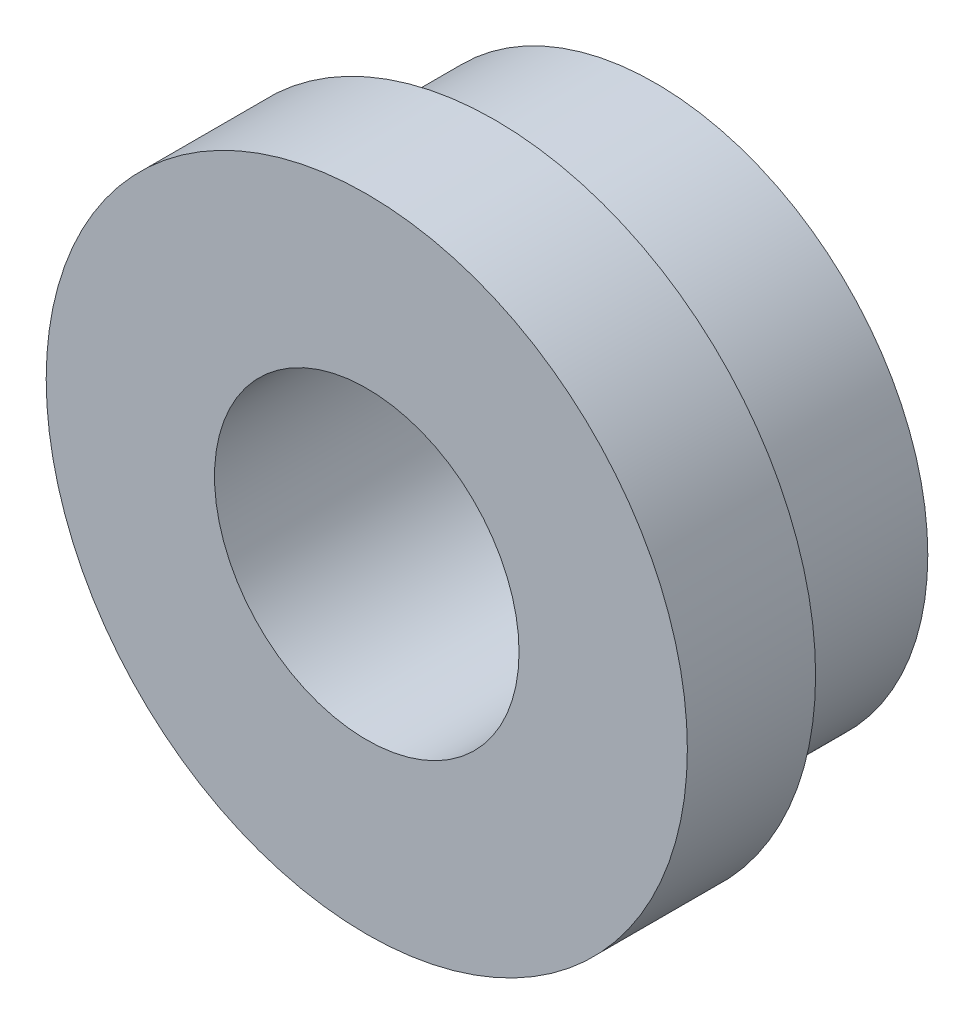
ISO-10303-21;
HEADER;
FILE_DESCRIPTION(('STEP AP214'),'2;1');
FILE_NAME('part.step','',(''),(''),'','','');
FILE_SCHEMA(('AUTOMOTIVE_DESIGN { 1 0 10303 214 1 1 1 1 }'));
ENDSEC;
DATA;
#1=APPLICATION_CONTEXT('core data for automotive mechanical design processes');
#2=APPLICATION_PROTOCOL_DEFINITION('international standard','automotive_design',2000,#1);
#3=PRODUCT_CONTEXT('',#1,'mechanical');
#4=PRODUCT('Part','Part','',(#3));
#5=PRODUCT_RELATED_PRODUCT_CATEGORY('part','',(#4));
#6=PRODUCT_DEFINITION_FORMATION('','',#4);
#7=PRODUCT_DEFINITION_CONTEXT('part definition',#1,'design');
#8=PRODUCT_DEFINITION('design','',#6,#7);
#9=PRODUCT_DEFINITION_SHAPE('','',#8);
#10=(LENGTH_UNIT() NAMED_UNIT(*) SI_UNIT(.MILLI.,.METRE.));
#11=(NAMED_UNIT(*) PLANE_ANGLE_UNIT() SI_UNIT($,.RADIAN.));
#12=(NAMED_UNIT(*) SI_UNIT($,.STERADIAN.) SOLID_ANGLE_UNIT());
#13=UNCERTAINTY_MEASURE_WITH_UNIT(LENGTH_MEASURE(1.E-05),#10,'distance_accuracy_value','');
#14=(GEOMETRIC_REPRESENTATION_CONTEXT(3) GLOBAL_UNCERTAINTY_ASSIGNED_CONTEXT((#13)) GLOBAL_UNIT_ASSIGNED_CONTEXT((#10,
#11,#12)) REPRESENTATION_CONTEXT('',''));
#15=CARTESIAN_POINT('',(0.,0.,0.));
#16=DIRECTION('',(0.,0.,1.));
#17=DIRECTION('',(1.,0.,0.));
#18=AXIS2_PLACEMENT_3D('',#15,#16,#17);
#19=CARTESIAN_POINT('',(0.,0.,0.));
#20=DIRECTION('',(0.,0.,1.));
#21=DIRECTION('',(1.,0.,0.));
#22=AXIS2_PLACEMENT_3D('',#19,#20,#21);
#23=PLANE('',#22);
#24=CARTESIAN_POINT('',(0.,0.,0.));
#25=DIRECTION('',(0.,0.,1.));
#26=DIRECTION('',(1.,0.,0.));
#27=AXIS2_PLACEMENT_3D('',#24,#25,#26);
#28=CIRCLE('',#27,11.5);
#29=CARTESIAN_POINT('',(11.5,0.,0.));
#30=VERTEX_POINT('',#29);
#31=EDGE_CURVE('E44',#30,#30,#28,.T.);
#32=ORIENTED_EDGE('',*,*,#31,.T.);
#33=EDGE_LOOP('',(#32));
#34=FACE_BOUND('',#33,.T.);
#35=CARTESIAN_POINT('',(0.,0.,0.));
#36=DIRECTION('',(0.,0.,1.));
#37=DIRECTION('',(1.,0.,0.));
#38=AXIS2_PLACEMENT_3D('',#35,#36,#37);
#39=CIRCLE('',#38,17.);
#40=CARTESIAN_POINT('',(17.,0.,0.));
#41=VERTEX_POINT('',#40);
#42=EDGE_CURVE('E51',#41,#41,#39,.T.);
#43=ORIENTED_EDGE('',*,*,#42,.F.);
#44=EDGE_LOOP('',(#43));
#45=FACE_BOUND('',#44,.T.);
#46=ADVANCED_FACE('F33',(#34,#45),#23,.F.);
#47=CARTESIAN_POINT('',(0.,0.,10.));
#48=DIRECTION('',(0.,0.,-1.));
#49=DIRECTION('',(-1.,0.,0.));
#50=AXIS2_PLACEMENT_3D('',#47,#48,#49);
#51=CYLINDRICAL_SURFACE('',#50,17.);
#52=CARTESIAN_POINT('',(0.,0.,10.));
#53=DIRECTION('',(0.,0.,1.));
#54=DIRECTION('',(1.,0.,0.));
#55=AXIS2_PLACEMENT_3D('',#52,#53,#54);
#56=CIRCLE('',#55,17.);
#57=CARTESIAN_POINT('',(17.,0.,10.));
#58=VERTEX_POINT('',#57);
#59=EDGE_CURVE('E48',#58,#58,#56,.T.);
#60=ORIENTED_EDGE('',*,*,#59,.F.);
#61=EDGE_LOOP('',(#60));
#62=FACE_BOUND('',#61,.T.);
#63=ORIENTED_EDGE('',*,*,#42,.T.);
#64=EDGE_LOOP('',(#63));
#65=FACE_BOUND('',#64,.T.);
#66=ADVANCED_FACE('F81',(#62,#65),#51,.T.);
#67=CARTESIAN_POINT('',(0.,0.,10.));
#68=DIRECTION('',(0.,0.,-1.));
#69=DIRECTION('',(-1.,0.,0.));
#70=AXIS2_PLACEMENT_3D('',#67,#68,#69);
#71=CYLINDRICAL_SURFACE('',#70,9.5);
#72=CARTESIAN_POINT('',(0.,0.,2.8284271247462));
#73=DIRECTION('',(0.,0.,1.));
#74=DIRECTION('',(1.,0.,0.));
#75=AXIS2_PLACEMENT_3D('',#72,#73,#74);
#76=CIRCLE('',#75,9.5);
#77=CARTESIAN_POINT('',(9.5,0.,2.8284271247462));
#78=VERTEX_POINT('',#77);
#79=EDGE_CURVE('E40',#78,#78,#76,.F.);
#80=ORIENTED_EDGE('',*,*,#79,.T.);
#81=EDGE_LOOP('',(#80));
#82=FACE_BOUND('',#81,.T.);
#83=CARTESIAN_POINT('',(0.,0.,18.));
#84=DIRECTION('',(0.,0.,1.));
#85=DIRECTION('',(1.,0.,0.));
#86=AXIS2_PLACEMENT_3D('',#83,#84,#85);
#87=CIRCLE('',#86,9.5);
#88=CARTESIAN_POINT('',(9.5,0.,18.));
#89=VERTEX_POINT('',#88);
#90=EDGE_CURVE('E60',#89,#89,#87,.T.);
#91=ORIENTED_EDGE('',*,*,#90,.T.);
#92=EDGE_LOOP('',(#91));
#93=FACE_BOUND('',#92,.T.);
#94=ADVANCED_FACE('F66',(#82,#93),#71,.F.);
#95=CARTESIAN_POINT('',(0.,0.,18.));
#96=DIRECTION('',(0.,0.,1.));
#97=DIRECTION('',(1.,0.,0.));
#98=AXIS2_PLACEMENT_3D('',#95,#96,#97);
#99=PLANE('',#98);
#100=CARTESIAN_POINT('',(0.,0.,18.));
#101=DIRECTION('',(0.,0.,1.));
#102=DIRECTION('',(1.,0.,0.));
#103=AXIS2_PLACEMENT_3D('',#100,#101,#102);
#104=CIRCLE('',#103,20.);
#105=CARTESIAN_POINT('',(20.,0.,18.));
#106=VERTEX_POINT('',#105);
#107=EDGE_CURVE('E54',#106,#106,#104,.T.);
#108=ORIENTED_EDGE('',*,*,#107,.T.);
#109=EDGE_LOOP('',(#108));
#110=FACE_BOUND('',#109,.T.);
#111=ORIENTED_EDGE('',*,*,#90,.F.);
#112=EDGE_LOOP('',(#111));
#113=FACE_BOUND('',#112,.T.);
#114=ADVANCED_FACE('F68',(#110,#113),#99,.T.);
#115=CARTESIAN_POINT('',(0.,0.,10.));
#116=DIRECTION('',(0.,0.,1.));
#117=DIRECTION('',(1.,0.,0.));
#118=AXIS2_PLACEMENT_3D('',#115,#116,#117);
#119=PLANE('',#118);
#120=ORIENTED_EDGE('',*,*,#59,.T.);
#121=EDGE_LOOP('',(#120));
#122=FACE_BOUND('',#121,.T.);
#123=CARTESIAN_POINT('',(0.,0.,10.));
#124=DIRECTION('',(0.,0.,1.));
#125=DIRECTION('',(1.,0.,0.));
#126=AXIS2_PLACEMENT_3D('',#123,#124,#125);
#127=CIRCLE('',#126,20.);
#128=CARTESIAN_POINT('',(20.,0.,10.));
#129=VERTEX_POINT('',#128);
#130=EDGE_CURVE('E57',#129,#129,#127,.T.);
#131=ORIENTED_EDGE('',*,*,#130,.F.);
#132=EDGE_LOOP('',(#131));
#133=FACE_BOUND('',#132,.T.);
#134=ADVANCED_FACE('F70',(#122,#133),#119,.F.);
#135=CARTESIAN_POINT('',(0.,0.,18.));
#136=DIRECTION('',(0.,0.,-1.));
#137=DIRECTION('',(-1.,0.,0.));
#138=AXIS2_PLACEMENT_3D('',#135,#136,#137);
#139=CYLINDRICAL_SURFACE('',#138,20.);
#140=ORIENTED_EDGE('',*,*,#107,.F.);
#141=EDGE_LOOP('',(#140));
#142=FACE_BOUND('',#141,.T.);
#143=ORIENTED_EDGE('',*,*,#130,.T.);
#144=EDGE_LOOP('',(#143));
#145=FACE_BOUND('',#144,.T.);
#146=ADVANCED_FACE('F77',(#142,#145),#139,.T.);
#147=CARTESIAN_POINT('',(0.,0.,0.));
#148=DIRECTION('',(0.,0.,-1.));
#149=DIRECTION('',(-1.,0.,0.));
#150=AXIS2_PLACEMENT_3D('',#147,#148,#149);
#151=CONICAL_SURFACE('',#150,11.5,0.785398163397446);
#152=CARTESIAN_POINT('',(0.,0.,1.41421356237311));
#153=DIRECTION('',(0.,0.,1.));
#154=DIRECTION('',(1.,0.,0.));
#155=AXIS2_PLACEMENT_3D('',#152,#153,#154);
#156=CIRCLE('',#155,10.0857864376269);
#157=CARTESIAN_POINT('',(10.0857864376269,0.,1.41421356237311));
#158=VERTEX_POINT('',#157);
#159=EDGE_CURVE('E10',#158,#158,#156,.T.);
#160=ORIENTED_EDGE('',*,*,#159,.T.);
#161=EDGE_LOOP('',(#160));
#162=FACE_BOUND('',#161,.T.);
#163=ORIENTED_EDGE('',*,*,#31,.F.);
#164=EDGE_LOOP('',(#163));
#165=FACE_BOUND('',#164,.T.);
#166=ADVANCED_FACE('F95',(#162,#165),#151,.F.);
#167=CARTESIAN_POINT('',(0.,0.,2.8284271247462));
#168=DIRECTION('',(0.,0.,1.));
#169=DIRECTION('',(1.,0.,0.));
#170=AXIS2_PLACEMENT_3D('',#167,#168,#169);
#171=TOROIDAL_SURFACE('',#170,11.5,2.);
#172=ORIENTED_EDGE('',*,*,#159,.F.);
#173=EDGE_LOOP('',(#172));
#174=FACE_BOUND('',#173,.T.);
#175=ORIENTED_EDGE('',*,*,#79,.F.);
#176=EDGE_LOOP('',(#175));
#177=FACE_BOUND('',#176,.T.);
#178=ADVANCED_FACE('F35',(#174,#177),#171,.T.);
#179=CLOSED_SHELL('',(#46,#66,#94,#114,#134,#146,#166,#178));
#180=MANIFOLD_SOLID_BREP('B2',#179);
#181=ADVANCED_BREP_SHAPE_REPRESENTATION('',(#18,#180),#14);
#182=SHAPE_DEFINITION_REPRESENTATION(#9,#181);
ENDSEC;
END-ISO-10303-21;
